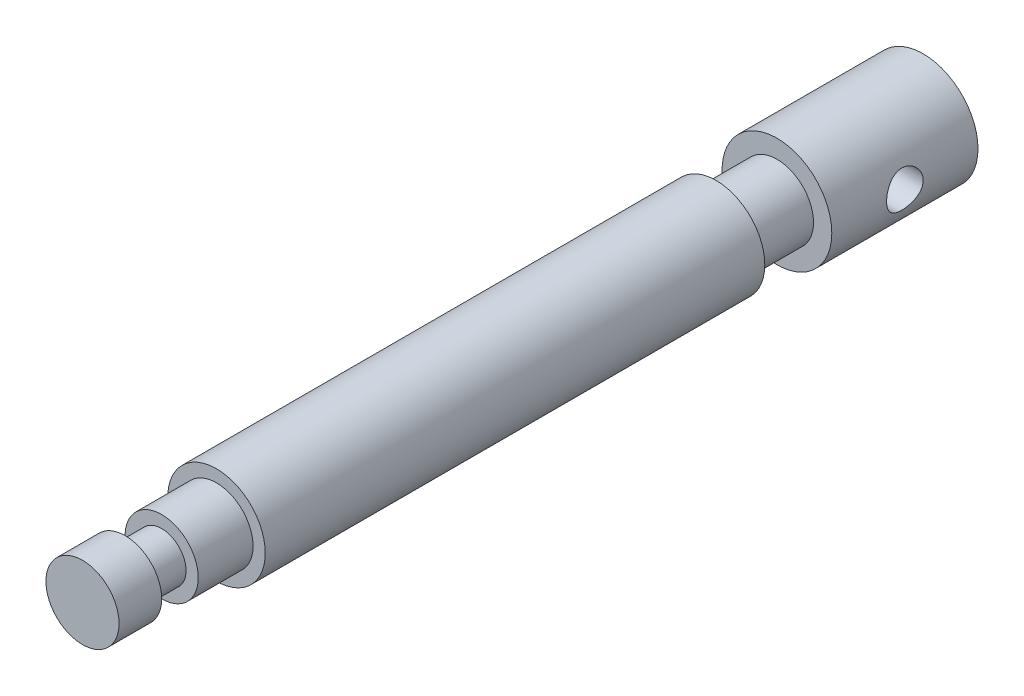
ISO-10303-21;
HEADER;
FILE_DESCRIPTION(('STEP AP214'),'2;1');
FILE_NAME('part.step','',(''),(''),'','','');
FILE_SCHEMA(('AUTOMOTIVE_DESIGN { 1 0 10303 214 1 1 1 1 }'));
ENDSEC;
DATA;
#1=APPLICATION_CONTEXT('core data for automotive mechanical design processes');
#2=APPLICATION_PROTOCOL_DEFINITION('international standard','automotive_design',2000,#1);
#3=PRODUCT_CONTEXT('',#1,'mechanical');
#4=PRODUCT('Part','Part','',(#3));
#5=PRODUCT_RELATED_PRODUCT_CATEGORY('part','',(#4));
#6=PRODUCT_DEFINITION_FORMATION('','',#4);
#7=PRODUCT_DEFINITION_CONTEXT('part definition',#1,'design');
#8=PRODUCT_DEFINITION('design','',#6,#7);
#9=PRODUCT_DEFINITION_SHAPE('','',#8);
#10=(LENGTH_UNIT() NAMED_UNIT(*) SI_UNIT(.MILLI.,.METRE.));
#11=(NAMED_UNIT(*) PLANE_ANGLE_UNIT() SI_UNIT($,.RADIAN.));
#12=(NAMED_UNIT(*) SI_UNIT($,.STERADIAN.) SOLID_ANGLE_UNIT());
#13=UNCERTAINTY_MEASURE_WITH_UNIT(LENGTH_MEASURE(1.E-05),#10,'distance_accuracy_value','');
#14=(GEOMETRIC_REPRESENTATION_CONTEXT(3) GLOBAL_UNCERTAINTY_ASSIGNED_CONTEXT((#13)) GLOBAL_UNIT_ASSIGNED_CONTEXT((#10,
#11,#12)) REPRESENTATION_CONTEXT('',''));
#15=CARTESIAN_POINT('',(0.,0.,0.));
#16=DIRECTION('',(0.,0.,1.));
#17=DIRECTION('',(1.,0.,0.));
#18=AXIS2_PLACEMENT_3D('',#15,#16,#17);
#19=CARTESIAN_POINT('',(4.44089209850063E-13,7.99999999999956,-33.79917184265));
#20=DIRECTION('',(0.,0.,1.));
#21=DIRECTION('',(1.,0.,0.));
#22=AXIS2_PLACEMENT_3D('',#19,#20,#21);
#23=PLANE('',#22);
#24=CARTESIAN_POINT('',(2.22044604925031E-13,0.,-33.7991718426501));
#25=DIRECTION('',(0.,0.,1.));
#26=DIRECTION('',(1.,0.,0.));
#27=AXIS2_PLACEMENT_3D('',#24,#25,#26);
#28=CIRCLE('',#27,8.);
#29=CARTESIAN_POINT('',(8.00000000000024,0.,-33.7991718426501));
#30=VERTEX_POINT('',#29);
#31=EDGE_CURVE('E56',#30,#30,#28,.T.);
#32=ORIENTED_EDGE('',*,*,#31,.F.);
#33=EDGE_LOOP('',(#32));
#34=FACE_BOUND('',#33,.T.);
#35=CARTESIAN_POINT('',(2.22044604925031E-13,0.,-33.7991718426501));
#36=DIRECTION('',(0.,0.,1.));
#37=DIRECTION('',(1.,0.,0.));
#38=AXIS2_PLACEMENT_3D('',#35,#36,#37);
#39=CIRCLE('',#38,6.);
#40=CARTESIAN_POINT('',(6.00000000000024,0.,-33.7991718426501));
#41=VERTEX_POINT('',#40);
#42=EDGE_CURVE('E110',#41,#41,#39,.T.);
#43=ORIENTED_EDGE('',*,*,#42,.T.);
#44=EDGE_LOOP('',(#43));
#45=FACE_BOUND('',#44,.T.);
#46=ADVANCED_FACE('F41',(#34,#45),#23,.F.);
#47=CARTESIAN_POINT('',(-1.11022302462516E-13,0.,78.3498964803312));
#48=DIRECTION('',(0.,0.,1.));
#49=DIRECTION('',(1.,0.,0.));
#50=AXIS2_PLACEMENT_3D('',#47,#48,#49);
#51=CYLINDRICAL_SURFACE('',#50,8.);
#52=CARTESIAN_POINT('',(1.11022302462516E-13,0.,48.2008281573498));
#53=DIRECTION('',(0.,0.,1.));
#54=DIRECTION('',(1.,0.,0.));
#55=AXIS2_PLACEMENT_3D('',#52,#53,#54);
#56=CIRCLE('',#55,8.);
#57=CARTESIAN_POINT('',(8.00000000000013,0.,48.2008281573498));
#58=VERTEX_POINT('',#57);
#59=EDGE_CURVE('E64',#58,#58,#56,.T.);
#60=ORIENTED_EDGE('',*,*,#59,.F.);
#61=EDGE_LOOP('',(#60));
#62=FACE_BOUND('',#61,.T.);
#63=ORIENTED_EDGE('',*,*,#31,.T.);
#64=EDGE_LOOP('',(#63));
#65=FACE_BOUND('',#64,.T.);
#66=ADVANCED_FACE('F94',(#62,#65),#51,.T.);
#67=CARTESIAN_POINT('',(0.,7.99999999999912,48.2008281573498));
#68=DIRECTION('',(0.,0.,-1.));
#69=DIRECTION('',(-1.,0.,0.));
#70=AXIS2_PLACEMENT_3D('',#67,#68,#69);
#71=PLANE('',#70);
#72=CARTESIAN_POINT('',(1.11022302462516E-13,0.,48.2008281573498));
#73=DIRECTION('',(0.,0.,1.));
#74=DIRECTION('',(1.,0.,0.));
#75=AXIS2_PLACEMENT_3D('',#72,#73,#74);
#76=CIRCLE('',#75,6.);
#77=CARTESIAN_POINT('',(6.00000000000013,0.,48.2008281573498));
#78=VERTEX_POINT('',#77);
#79=EDGE_CURVE('E143',#78,#78,#76,.T.);
#80=ORIENTED_EDGE('',*,*,#79,.F.);
#81=EDGE_LOOP('',(#80));
#82=FACE_BOUND('',#81,.T.);
#83=ORIENTED_EDGE('',*,*,#59,.T.);
#84=EDGE_LOOP('',(#83));
#85=FACE_BOUND('',#84,.T.);
#86=ADVANCED_FACE('F102',(#82,#85),#71,.F.);
#87=CARTESIAN_POINT('',(-1.11022302462516E-13,0.,78.3498964803312));
#88=DIRECTION('',(0.,0.,1.));
#89=DIRECTION('',(1.,0.,0.));
#90=AXIS2_PLACEMENT_3D('',#87,#88,#89);
#91=CYLINDRICAL_SURFACE('',#90,6.);
#92=CARTESIAN_POINT('',(-1.11022302462516E-13,-4.44089209850063E-13,57.2008281573498));
#93=DIRECTION('',(0.,0.,1.));
#94=DIRECTION('',(1.,0.,0.));
#95=AXIS2_PLACEMENT_3D('',#92,#93,#94);
#96=CIRCLE('',#95,6.);
#97=CARTESIAN_POINT('',(5.9999999999999,-4.43423076035288E-13,57.2008281573498));
#98=VERTEX_POINT('',#97);
#99=EDGE_CURVE('E139',#98,#98,#96,.T.);
#100=ORIENTED_EDGE('',*,*,#99,.F.);
#101=EDGE_LOOP('',(#100));
#102=FACE_BOUND('',#101,.T.);
#103=ORIENTED_EDGE('',*,*,#79,.T.);
#104=EDGE_LOOP('',(#103));
#105=FACE_BOUND('',#104,.T.);
#106=ADVANCED_FACE('F152',(#102,#105),#91,.T.);
#107=CARTESIAN_POINT('',(-2.22044604925031E-13,6.00000000000023,57.2008281573509));
#108=DIRECTION('',(0.,0.,-1.));
#109=DIRECTION('',(-1.,0.,0.));
#110=AXIS2_PLACEMENT_3D('',#107,#108,#109);
#111=PLANE('',#110);
#112=CARTESIAN_POINT('',(-1.11022302462516E-13,-4.44089209850063E-13,57.2008281573498));
#113=DIRECTION('',(0.,0.,1.));
#114=DIRECTION('',(1.,0.,0.));
#115=AXIS2_PLACEMENT_3D('',#112,#113,#114);
#116=CIRCLE('',#115,4.);
#117=CARTESIAN_POINT('',(3.9999999999999,-4.43645120640213E-13,57.2008281573498));
#118=VERTEX_POINT('',#117);
#119=EDGE_CURVE('E136',#118,#118,#116,.T.);
#120=ORIENTED_EDGE('',*,*,#119,.F.);
#121=EDGE_LOOP('',(#120));
#122=FACE_BOUND('',#121,.T.);
#123=ORIENTED_EDGE('',*,*,#99,.T.);
#124=EDGE_LOOP('',(#123));
#125=FACE_BOUND('',#124,.T.);
#126=ADVANCED_FACE('F163',(#122,#125),#111,.F.);
#127=CARTESIAN_POINT('',(-1.11022302462516E-13,0.,78.3498964803312));
#128=DIRECTION('',(0.,0.,1.));
#129=DIRECTION('',(1.,0.,0.));
#130=AXIS2_PLACEMENT_3D('',#127,#128,#129);
#131=CYLINDRICAL_SURFACE('',#130,4.);
#132=CARTESIAN_POINT('',(0.,0.,63.2008281573498));
#133=DIRECTION('',(0.,0.,1.));
#134=DIRECTION('',(1.,0.,0.));
#135=AXIS2_PLACEMENT_3D('',#132,#133,#134);
#136=CIRCLE('',#135,4.);
#137=CARTESIAN_POINT('',(4.00000000000001,0.,63.2008281573498));
#138=VERTEX_POINT('',#137);
#139=EDGE_CURVE('E135',#138,#138,#136,.T.);
#140=ORIENTED_EDGE('',*,*,#139,.F.);
#141=EDGE_LOOP('',(#140));
#142=FACE_BOUND('',#141,.T.);
#143=ORIENTED_EDGE('',*,*,#119,.T.);
#144=EDGE_LOOP('',(#143));
#145=FACE_BOUND('',#144,.T.);
#146=ADVANCED_FACE('F166',(#142,#145),#131,.T.);
#147=CARTESIAN_POINT('',(0.,4.,63.2008281573511));
#148=DIRECTION('',(0.,0.,1.));
#149=DIRECTION('',(1.,0.,0.));
#150=AXIS2_PLACEMENT_3D('',#147,#148,#149);
#151=PLANE('',#150);
#152=CARTESIAN_POINT('',(0.,0.,63.2008281573498));
#153=DIRECTION('',(0.,0.,1.));
#154=DIRECTION('',(1.,0.,0.));
#155=AXIS2_PLACEMENT_3D('',#152,#153,#154);
#156=CIRCLE('',#155,6.);
#157=CARTESIAN_POINT('',(6.00000000000002,0.,63.2008281573498));
#158=VERTEX_POINT('',#157);
#159=EDGE_CURVE('E126',#158,#158,#156,.T.);
#160=ORIENTED_EDGE('',*,*,#159,.F.);
#161=EDGE_LOOP('',(#160));
#162=FACE_BOUND('',#161,.T.);
#163=ORIENTED_EDGE('',*,*,#139,.T.);
#164=EDGE_LOOP('',(#163));
#165=FACE_BOUND('',#164,.T.);
#166=ADVANCED_FACE('F175',(#162,#165),#151,.F.);
#167=CARTESIAN_POINT('',(-1.11022302462516E-13,0.,78.3498964803312));
#168=DIRECTION('',(0.,0.,1.));
#169=DIRECTION('',(1.,0.,0.));
#170=AXIS2_PLACEMENT_3D('',#167,#168,#169);
#171=CYLINDRICAL_SURFACE('',#170,6.);
#172=CARTESIAN_POINT('',(0.,0.,70.2008281573498));
#173=DIRECTION('',(0.,0.,1.));
#174=DIRECTION('',(1.,0.,0.));
#175=AXIS2_PLACEMENT_3D('',#172,#173,#174);
#176=CIRCLE('',#175,6.);
#177=CARTESIAN_POINT('',(6.00000000000001,0.,70.2008281573498));
#178=VERTEX_POINT('',#177);
#179=EDGE_CURVE('E125',#178,#178,#176,.T.);
#180=ORIENTED_EDGE('',*,*,#179,.F.);
#181=EDGE_LOOP('',(#180));
#182=FACE_BOUND('',#181,.T.);
#183=ORIENTED_EDGE('',*,*,#159,.T.);
#184=EDGE_LOOP('',(#183));
#185=FACE_BOUND('',#184,.T.);
#186=ADVANCED_FACE('F176',(#182,#185),#171,.T.);
#187=CARTESIAN_POINT('',(0.,6.00000000000001,70.200828157351));
#188=DIRECTION('',(0.,0.,-1.));
#189=DIRECTION('',(-1.,0.,0.));
#190=AXIS2_PLACEMENT_3D('',#187,#188,#189);
#191=PLANE('',#190);
#192=ORIENTED_EDGE('',*,*,#179,.T.);
#193=EDGE_LOOP('',(#192));
#194=FACE_BOUND('',#193,.T.);
#195=ADVANCED_FACE('F179',(#194),#191,.F.);
#196=CARTESIAN_POINT('',(0.,8.9999999999999,-67.7991718426502));
#197=DIRECTION('',(0.,0.,1.));
#198=DIRECTION('',(1.,0.,0.));
#199=AXIS2_PLACEMENT_3D('',#196,#197,#198);
#200=PLANE('',#199);
#201=CARTESIAN_POINT('',(0.,-2.22044604925031E-13,-67.7991718426502));
#202=DIRECTION('',(0.,0.,1.));
#203=DIRECTION('',(1.,0.,0.));
#204=AXIS2_PLACEMENT_3D('',#201,#202,#203);
#205=CIRCLE('',#204,9.);
#206=CARTESIAN_POINT('',(9.00000000000002,-2.21045404202869E-13,-67.7991718426502));
#207=VERTEX_POINT('',#206);
#208=EDGE_CURVE('E119',#207,#207,#205,.T.);
#209=ORIENTED_EDGE('',*,*,#208,.F.);
#210=EDGE_LOOP('',(#209));
#211=FACE_BOUND('',#210,.T.);
#212=ADVANCED_FACE('F91',(#211),#200,.F.);
#213=CARTESIAN_POINT('',(-1.11022302462516E-13,0.,78.3498964803312));
#214=DIRECTION('',(0.,0.,1.));
#215=DIRECTION('',(1.,0.,0.));
#216=AXIS2_PLACEMENT_3D('',#213,#214,#215);
#217=CYLINDRICAL_SURFACE('',#216,9.);
#218=CARTESIAN_POINT('',(-9.00000000000012,0.,-58.799171842649));
#219=CARTESIAN_POINT('',(-9.00000045902853,0.163690088660168,-58.799172603844));
#220=CARTESIAN_POINT('',(-8.9954930852267,0.327375583615664,-58.7857310442674));
#221=CARTESIAN_POINT('',(-8.97795630609828,0.6499252826189,-58.7324845161974));
#222=CARTESIAN_POINT('',(-8.96492601606378,0.808788984356388,-58.6926768108023));
#223=CARTESIAN_POINT('',(-8.93175923719251,1.1169983685053,-58.5882141124969));
#224=CARTESIAN_POINT('',(-8.91163463192553,1.26635947765815,-58.5236006552712));
#225=CARTESIAN_POINT('',(-8.86633337152053,1.55212481041604,-58.371548324134));
#226=CARTESIAN_POINT('',(-8.84115572003326,1.68852647087612,-58.2841049476412));
#227=CARTESIAN_POINT('',(-8.78742283329007,1.94922502506681,-58.0856944280728));
#228=CARTESIAN_POINT('',(-8.75878669391383,2.073011100895,-57.9740781398675));
#229=CARTESIAN_POINT('',(-8.70180944349356,2.30049807810623,-57.7318703785293));
#230=CARTESIAN_POINT('',(-8.67346839871565,2.40419455646821,-57.6012747378635));
#231=CARTESIAN_POINT('',(-8.61939997431734,2.5914748266834,-57.3202164970597));
#232=CARTESIAN_POINT('',(-8.59377117827051,2.67439457466308,-57.1692906234527));
#233=CARTESIAN_POINT('',(-8.54925916255838,2.81345662163321,-56.8546435592734));
#234=CARTESIAN_POINT('',(-8.53037388482246,2.86960709216023,-56.6909262911608));
#235=CARTESIAN_POINT('',(-8.50233909808137,2.95162038452741,-56.3611521781588));
#236=CARTESIAN_POINT('',(-8.49288287308859,2.97844034481532,-56.1953602171818));
#237=CARTESIAN_POINT('',(-8.48386969888519,3.00402337000344,-55.8613805801813));
#238=CARTESIAN_POINT('',(-8.48430969068137,3.00279510481408,-55.6931936605214));
#239=CARTESIAN_POINT('',(-8.49477045024496,2.97305971111018,-55.367361951317));
#240=CARTESIAN_POINT('',(-8.50435247602606,2.94580173950099,-55.209586633892));
#241=CARTESIAN_POINT('',(-8.53129973173667,2.86681848854825,-54.9009915838286));
#242=CARTESIAN_POINT('',(-8.54866589352293,2.81509027977553,-54.7501726863438));
#243=CARTESIAN_POINT('',(-8.58953733393723,2.68781717418056,-54.4569335938746));
#244=CARTESIAN_POINT('',(-8.61313697379381,2.61190214612182,-54.3146877662405));
#245=CARTESIAN_POINT('',(-8.6637767572717,2.43866731890945,-54.0445591178099));
#246=CARTESIAN_POINT('',(-8.69081789371292,2.34134133709196,-53.9166804618488));
#247=CARTESIAN_POINT('',(-8.74701987503116,2.12204799804664,-53.6718970481666));
#248=CARTESIAN_POINT('',(-8.77621768064513,1.99905945022896,-53.5559137591219));
#249=CARTESIAN_POINT('',(-8.83220815161146,1.73501870991027,-53.3459780426589));
#250=CARTESIAN_POINT('',(-8.85900058614198,1.59396478698247,-53.2520277281556));
#251=CARTESIAN_POINT('',(-8.9075132381337,1.29584283913879,-53.0880829419438));
#252=CARTESIAN_POINT('',(-8.92918050024142,1.13862982924901,-53.0183353686268));
#253=CARTESIAN_POINT('',(-8.96461701433304,0.813807250093453,-52.9065623207819));
#254=CARTESIAN_POINT('',(-8.97838900964578,0.646201314464719,-52.8645272163787));
#255=CARTESIAN_POINT('',(-8.99602881214266,0.313151488587711,-52.8110048445819));
#256=CARTESIAN_POINT('',(-9.00030005501188,0.14792879959435,-52.7982724151308));
#257=CARTESIAN_POINT('',(-8.999667080845,-0.182325209880841,-52.8001698634445));
#258=CARTESIAN_POINT('',(-8.99476441258062,-0.347356557959032,-52.8147951225886));
#259=CARTESIAN_POINT('',(-8.97660074151284,-0.667559598913051,-52.8700075658568));
#260=CARTESIAN_POINT('',(-8.96358596133584,-0.822878420505058,-52.9098304607975));
#261=CARTESIAN_POINT('',(-8.93075540490211,-1.1245678757394,-53.0133521760497));
#262=CARTESIAN_POINT('',(-8.91093876139983,-1.2709373655264,-53.0770540410534));
#263=CARTESIAN_POINT('',(-8.86586793861824,-1.55486488918059,-53.2283831381726));
#264=CARTESIAN_POINT('',(-8.84048444267355,-1.69208987765252,-53.3165956224993));
#265=CARTESIAN_POINT('',(-8.78715761748771,-1.95019449040766,-53.5137542926902));
#266=CARTESIAN_POINT('',(-8.75921350781411,-2.07106910338712,-53.6227068107454));
#267=CARTESIAN_POINT('',(-8.7023054394126,-2.29875752341915,-53.8641080956701));
#268=CARTESIAN_POINT('',(-8.67335283262268,-2.40468290773796,-53.9973995234307));
#269=CARTESIAN_POINT('',(-8.61899919884124,-2.59277256697143,-54.2804865460827));
#270=CARTESIAN_POINT('',(-8.5935982014596,-2.67493664379341,-54.4302822785524));
#271=CARTESIAN_POINT('',(-8.54947175374095,-2.8127907912492,-54.74219088852));
#272=CARTESIAN_POINT('',(-8.53073282378917,-2.86853439649528,-54.9042780801566));
#273=CARTESIAN_POINT('',(-8.50232496919368,-2.95168400027845,-55.2363077927826));
#274=CARTESIAN_POINT('',(-8.4926519587094,-2.97910276486227,-55.4062467388633));
#275=CARTESIAN_POINT('',(-8.48393576622554,-3.00382884743224,-55.7397631307729));
#276=CARTESIAN_POINT('',(-8.48437200772266,-3.00261077192513,-55.9032188635106));
#277=CARTESIAN_POINT('',(-8.49453809471611,-2.97372688034595,-56.2274670674164));
#278=CARTESIAN_POINT('',(-8.50426738708083,-2.94606263837585,-56.3882596965155));
#279=CARTESIAN_POINT('',(-8.53153572914683,-2.86611543938797,-56.6995788316575));
#280=CARTESIAN_POINT('',(-8.5489229406746,-2.81431003804611,-56.8502423176634));
#281=CARTESIAN_POINT('',(-8.58949196455426,-2.68793809727886,-57.1408540634648));
#282=CARTESIAN_POINT('',(-8.61267506290174,-2.61336650566144,-57.2807999362143));
#283=CARTESIAN_POINT('',(-8.66348487678137,-2.43978207775027,-57.5526228524189));
#284=CARTESIAN_POINT('',(-8.69126134926442,-2.33984472829322,-57.6838813483448));
#285=CARTESIAN_POINT('',(-8.74750068849779,-2.11992864940635,-57.9282412828023));
#286=CARTESIAN_POINT('',(-8.77596374737095,-1.99994425335427,-58.0413375697144));
#287=CARTESIAN_POINT('',(-8.83170091576596,-1.73772467076208,-58.2506050795176));
#288=CARTESIAN_POINT('',(-8.85888545403764,-1.59480454049895,-58.3459448859024));
#289=CARTESIAN_POINT('',(-8.90777973517872,-1.29407207221961,-58.5111431292009));
#290=CARTESIAN_POINT('',(-8.92949087723837,-1.136263554397,-58.5810080804152));
#291=CARTESIAN_POINT('',(-8.96416545205664,-0.81748094160303,-58.6903367401151));
#292=CARTESIAN_POINT('',(-8.97747637267588,-0.656963273029262,-58.7310192414392));
#293=CARTESIAN_POINT('',(-8.99539221192668,-0.330961248030728,-58.7854326846804));
#294=CARTESIAN_POINT('',(-8.99999953595718,-0.165478276706242,-58.7991710731387));
#295=CARTESIAN_POINT('',(-9.00000000000012,0.,-58.799171842649));
#296=B_SPLINE_CURVE_WITH_KNOTS('',3,(#218,#219,#220,#221,#222,#223,#224,#225,#226,#227,#228,
#229,#230,#231,#232,#233,#234,#235,#236,#237,#238,#239,#240,#241,#242,#243,#244,#245,#246,#247,
#248,#249,#250,#251,#252,#253,#254,#255,#256,#257,#258,#259,#260,#261,#262,#263,#264,#265,#266,
#267,#268,#269,#270,#271,#272,#273,#274,#275,#276,#277,#278,#279,#280,#281,#282,#283,#284,#285,
#286,#287,#288,#289,#290,#291,#292,#293,#294,#295),.UNSPECIFIED.,.T.,.F.,(4,2,2,2,2,2,2,2,2,2,2,
2,2,2,2,2,2,2,2,2,2,2,2,2,2,2,2,2,2,2,2,2,2,2,2,2,2,2,4),(0.,0.490461318078023,0.9809735558026,
1.47066801861085,1.96045913339728,2.46554052848267,2.97073299862592,3.4904515447041,
4.01001134078498,4.51205777225521,5.01394901962455,5.49290479653835,5.9719179256644,
6.45864513465382,6.94551307674607,7.45779917434091,7.97013437899849,8.48755216951072,
9.00479006631636,9.49960749525519,9.99434139492532,10.474744739347,10.9552093585243,
11.4483119953132,11.9415654246577,12.4572306864235,12.9729002470509,13.4875204148041,
14.0019085411761,14.4898699819286,14.9778023805421,15.4564676124133,15.9352391452801,
16.4349020007549,16.934706333714,17.4539898250533,17.9731404345737,18.4690967512144,
18.9649159811442),.UNSPECIFIED.);
#297=CARTESIAN_POINT('',(-9.00000000000012,0.,-58.799171842649));
#298=VERTEX_POINT('',#297);
#299=EDGE_CURVE('E10',#298,#298,#296,.T.);
#300=ORIENTED_EDGE('',*,*,#299,.T.);
#301=EDGE_LOOP('',(#300));
#302=FACE_BOUND('',#301,.T.);
#303=CARTESIAN_POINT('',(9.00000000000001,0.,-58.7991718426502));
#304=CARTESIAN_POINT('',(9.00000045902836,-0.163690088659977,-58.799172603845));
#305=CARTESIAN_POINT('',(8.99549308522625,-0.327375583615219,-58.7857310442671));
#306=CARTESIAN_POINT('',(8.97795630609833,-0.64992528261868,-58.7324845161978));
#307=CARTESIAN_POINT('',(8.96492601606464,-0.80878898435665,-58.6926768108045));
#308=CARTESIAN_POINT('',(8.93175923719342,-1.11699836850518,-58.5882141124992));
#309=CARTESIAN_POINT('',(8.91163463192567,-1.26635947765718,-58.5236006552717));
#310=CARTESIAN_POINT('',(8.8663333715202,-1.55212481041543,-58.3715483241344));
#311=CARTESIAN_POINT('',(8.84115572003323,-1.68852647087675,-58.2841049476434));
#312=CARTESIAN_POINT('',(8.7874228332901,-1.94922502506751,-58.0856944280753));
#313=CARTESIAN_POINT('',(8.75878669391361,-2.07301110089448,-57.9740781398686));
#314=CARTESIAN_POINT('',(8.70180944349366,-2.3004980781055,-57.7318703785296));
#315=CARTESIAN_POINT('',(8.67346839871632,-2.4041945564685,-57.6012747378645));
#316=CARTESIAN_POINT('',(8.61939997431801,-2.59147482668396,-57.320216497061));
#317=CARTESIAN_POINT('',(8.59377117827057,-2.67439457466287,-57.1692906234536));
#318=CARTESIAN_POINT('',(8.54925916255812,-2.81345662163266,-56.8546435592741));
#319=CARTESIAN_POINT('',(8.53037388482248,-2.86960709216012,-56.6909262911618));
#320=CARTESIAN_POINT('',(8.50233909808135,-2.95162038452752,-56.36115217816));
#321=CARTESIAN_POINT('',(8.49288287308826,-2.97844034481522,-56.1953602171829));
#322=CARTESIAN_POINT('',(8.48386969888514,-3.00402337000336,-55.8613805801825));
#323=CARTESIAN_POINT('',(8.48430969068193,-3.00279510481421,-55.6931936605226));
#324=CARTESIAN_POINT('',(8.49477045024529,-2.97305971111048,-55.367361951318));
#325=CARTESIAN_POINT('',(8.50435247602565,-2.94580173950125,-55.209586633893));
#326=CARTESIAN_POINT('',(8.53129973173646,-2.86681848854852,-54.9009915838296));
#327=CARTESIAN_POINT('',(8.54866589352367,-2.81509027977585,-54.750172686345));
#328=CARTESIAN_POINT('',(8.5895373339378,-2.68781717418119,-54.4569335938758));
#329=CARTESIAN_POINT('',(8.61313697379323,-2.61190214612272,-54.3146877662415));
#330=CARTESIAN_POINT('',(8.66377675727137,-2.43866731891017,-54.0445591178115));
#331=CARTESIAN_POINT('',(8.69081789371397,-2.34134133709221,-53.9166804618513));
#332=CARTESIAN_POINT('',(8.74701987503237,-2.12204799804714,-53.6718970481688));
#333=CARTESIAN_POINT('',(8.77621768064496,-1.99905945023021,-53.5559137591227));
#334=CARTESIAN_POINT('',(8.83220815161068,-1.73501870991135,-53.3459780426599));
#335=CARTESIAN_POINT('',(8.85900058614198,-1.59396478698263,-53.252027728158));
#336=CARTESIAN_POINT('',(8.90751323813393,-1.29584283913864,-53.088082941946));
#337=CARTESIAN_POINT('',(8.92918050024107,-1.13862982924947,-53.0183353686273));
#338=CARTESIAN_POINT('',(8.96461701433281,-0.813807250094185,-52.9065623207819));
#339=CARTESIAN_POINT('',(8.97838900964623,-0.646201314465094,-52.8645272163799));
#340=CARTESIAN_POINT('',(8.9960288121431,-0.313151488587794,-52.8110048445831));
#341=CARTESIAN_POINT('',(9.00030005501168,-0.147928799594482,-52.7982724151308));
#342=CARTESIAN_POINT('',(8.99966708084476,0.182325209880679,-52.8001698634444));
#343=CARTESIAN_POINT('',(8.99476441258096,0.34735655795889,-52.8147951225898));
#344=CARTESIAN_POINT('',(8.97660074151318,0.667559598912934,-52.8700075658581));
#345=CARTESIAN_POINT('',(8.96358596133564,0.822878420504946,-52.9098304607977));
#346=CARTESIAN_POINT('',(8.93075540490194,1.12456787573898,-53.0133521760493));
#347=CARTESIAN_POINT('',(8.91093876140025,1.27093736552567,-53.0770540410535));
#348=CARTESIAN_POINT('',(8.86586793861867,1.55486488917977,-53.2283831381727));
#349=CARTESIAN_POINT('',(8.84048444267338,1.69208987765192,-53.316595622499));
#350=CARTESIAN_POINT('',(8.78715761748766,1.9501944904072,-53.5137542926898));
#351=CARTESIAN_POINT('',(8.75921350781479,2.0710691033866,-53.6227068107454));
#352=CARTESIAN_POINT('',(8.70230543941327,2.29875752341875,-53.8641080956701));
#353=CARTESIAN_POINT('',(8.67335283262254,2.40468290773777,-53.9973995234304));
#354=CARTESIAN_POINT('',(8.61899919884108,2.59277256697118,-54.2804865460823));
#355=CARTESIAN_POINT('',(8.59359820146023,2.67493664379289,-54.4302822785523));
#356=CARTESIAN_POINT('',(8.54947175374166,2.81279079124885,-54.7421908885199));
#357=CARTESIAN_POINT('',(8.53073282378916,2.86853439649535,-54.9042780801563));
#358=CARTESIAN_POINT('',(8.5023249691933,2.95168400027825,-55.2363077927823));
#359=CARTESIAN_POINT('',(8.49265195870937,2.97910276486137,-55.4062467388632));
#360=CARTESIAN_POINT('',(8.48393576622558,3.00382884743136,-55.739763130773));
#361=CARTESIAN_POINT('',(8.48437200772245,3.0026107719249,-55.9032188635107));
#362=CARTESIAN_POINT('',(8.49453809471587,2.97372688034618,-56.2274670674164));
#363=CARTESIAN_POINT('',(8.50426738708081,2.9460626383759,-56.3882596965155));
#364=CARTESIAN_POINT('',(8.53153572914685,2.86611543938791,-56.6995788316576));
#365=CARTESIAN_POINT('',(8.54892294067445,2.81431003804612,-56.8502423176635));
#366=CARTESIAN_POINT('',(8.58949196455399,2.6879380972788,-57.1408540634649));
#367=CARTESIAN_POINT('',(8.61267506290151,2.61336650566125,-57.2807999362143));
#368=CARTESIAN_POINT('',(8.66348487678114,2.43978207775004,-57.5526228524188));
#369=CARTESIAN_POINT('',(8.69126134926414,2.33984472829311,-57.6838813483448));
#370=CARTESIAN_POINT('',(8.74750068849764,2.11992864940636,-57.9282412828024));
#371=CARTESIAN_POINT('',(8.77596374737097,1.9999442533543,-58.0413375697145));
#372=CARTESIAN_POINT('',(8.83170091576597,1.73772467076192,-58.2506050795176));
#373=CARTESIAN_POINT('',(8.85888545403746,1.59480454049857,-58.3459448859024));
#374=CARTESIAN_POINT('',(8.9077797351786,1.29407207221914,-58.5111431292014));
#375=CARTESIAN_POINT('',(8.92949087723849,1.13626355439666,-58.5810080804164));
#376=CARTESIAN_POINT('',(8.96416545205672,0.817480941602713,-58.690336740116));
#377=CARTESIAN_POINT('',(8.97747637267571,0.656963273028864,-58.7310192414392));
#378=CARTESIAN_POINT('',(8.99539221192644,0.330961248030386,-58.7854326846805));
#379=CARTESIAN_POINT('',(8.99999953595713,0.165478276706038,-58.7991710731399));
#380=CARTESIAN_POINT('',(9.00000000000001,0.,-58.7991718426502));
#381=B_SPLINE_CURVE_WITH_KNOTS('',3,(#303,#304,#305,#306,#307,#308,#309,#310,#311,#312,#313,
#314,#315,#316,#317,#318,#319,#320,#321,#322,#323,#324,#325,#326,#327,#328,#329,#330,#331,#332,
#333,#334,#335,#336,#337,#338,#339,#340,#341,#342,#343,#344,#345,#346,#347,#348,#349,#350,#351,
#352,#353,#354,#355,#356,#357,#358,#359,#360,#361,#362,#363,#364,#365,#366,#367,#368,#369,#370,
#371,#372,#373,#374,#375,#376,#377,#378,#379,#380),.UNSPECIFIED.,.T.,.F.,(4,2,2,2,2,2,2,2,2,2,2,
2,2,2,2,2,2,2,2,2,2,2,2,2,2,2,2,2,2,2,2,2,2,2,2,2,2,2,4),(0.,0.490461318077797,
0.980973555802043,1.47066801861044,1.96045913339705,2.46554052848261,2.97073299862605,
3.49045154470416,4.01001134078492,4.51205777225511,5.01394901962448,5.49290479653831,
5.97191792566433,6.45864513465329,6.94551307674509,7.45779917434017,7.97013437899803,
8.48755216951055,9.00479006631634,9.4996074952553,9.99434139492569,10.4747447393468,
10.9552093585235,11.4483119953125,11.9415654246573,12.4572306864231,12.9729002470505,
13.4875204148037,14.0019085411758,14.4898699819284,14.9778023805419,15.4564676124131,
15.9352391452799,16.4349020007547,16.9347063337138,17.4539898250535,17.9731404345743,
18.4690967512147,18.9649159811442),.UNSPECIFIED.);
#382=CARTESIAN_POINT('',(9.00000000000001,0.,-58.7991718426502));
#383=VERTEX_POINT('',#382);
#384=EDGE_CURVE('E52',#383,#383,#381,.T.);
#385=ORIENTED_EDGE('',*,*,#384,.T.);
#386=EDGE_LOOP('',(#385));
#387=FACE_BOUND('',#386,.T.);
#388=CARTESIAN_POINT('',(1.11022302462516E-13,0.,-43.7991718426501));
#389=DIRECTION('',(0.,0.,1.));
#390=DIRECTION('',(1.,0.,0.));
#391=AXIS2_PLACEMENT_3D('',#388,#389,#390);
#392=CIRCLE('',#391,9.);
#393=CARTESIAN_POINT('',(9.00000000000013,0.,-43.7991718426501));
#394=VERTEX_POINT('',#393);
#395=EDGE_CURVE('E114',#394,#394,#392,.T.);
#396=ORIENTED_EDGE('',*,*,#395,.F.);
#397=EDGE_LOOP('',(#396));
#398=FACE_BOUND('',#397,.T.);
#399=ORIENTED_EDGE('',*,*,#208,.T.);
#400=EDGE_LOOP('',(#399));
#401=FACE_BOUND('',#400,.T.);
#402=ADVANCED_FACE('F73',(#302,#387,#398,#401),#217,.T.);
#403=CARTESIAN_POINT('',(1.11022302462516E-13,5.99999999999978,-43.799171842649));
#404=DIRECTION('',(0.,0.,-1.));
#405=DIRECTION('',(-1.,0.,0.));
#406=AXIS2_PLACEMENT_3D('',#403,#404,#405);
#407=PLANE('',#406);
#408=CARTESIAN_POINT('',(1.11022302462516E-13,0.,-43.7991718426501));
#409=DIRECTION('',(0.,0.,1.));
#410=DIRECTION('',(1.,0.,0.));
#411=AXIS2_PLACEMENT_3D('',#408,#409,#410);
#412=CIRCLE('',#411,6.);
#413=CARTESIAN_POINT('',(6.00000000000013,0.,-43.7991718426501));
#414=VERTEX_POINT('',#413);
#415=EDGE_CURVE('E107',#414,#414,#412,.T.);
#416=ORIENTED_EDGE('',*,*,#415,.F.);
#417=EDGE_LOOP('',(#416));
#418=FACE_BOUND('',#417,.T.);
#419=ORIENTED_EDGE('',*,*,#395,.T.);
#420=EDGE_LOOP('',(#419));
#421=FACE_BOUND('',#420,.T.);
#422=ADVANCED_FACE('F81',(#418,#421),#407,.F.);
#423=CARTESIAN_POINT('',(-1.11022302462516E-13,0.,78.3498964803312));
#424=DIRECTION('',(0.,0.,1.));
#425=DIRECTION('',(1.,0.,0.));
#426=AXIS2_PLACEMENT_3D('',#423,#424,#425);
#427=CYLINDRICAL_SURFACE('',#426,6.);
#428=ORIENTED_EDGE('',*,*,#42,.F.);
#429=EDGE_LOOP('',(#428));
#430=FACE_BOUND('',#429,.T.);
#431=ORIENTED_EDGE('',*,*,#415,.T.);
#432=EDGE_LOOP('',(#431));
#433=FACE_BOUND('',#432,.T.);
#434=ADVANCED_FACE('F80',(#430,#433),#427,.T.);
#435=CARTESIAN_POINT('',(-9.00000000000001,0.,-55.799171842649));
#436=DIRECTION('',(1.,0.,0.));
#437=DIRECTION('',(0.,0.,-1.));
#438=AXIS2_PLACEMENT_3D('',#435,#436,#437);
#439=CYLINDRICAL_SURFACE('',#438,3.);
#440=ORIENTED_EDGE('',*,*,#384,.F.);
#441=EDGE_LOOP('',(#440));
#442=FACE_BOUND('',#441,.T.);
#443=ORIENTED_EDGE('',*,*,#299,.F.);
#444=EDGE_LOOP('',(#443));
#445=FACE_BOUND('',#444,.T.);
#446=ADVANCED_FACE('F74',(#442,#445),#439,.F.);
#447=CLOSED_SHELL('',(#46,#66,#86,#106,#126,#146,#166,#186,#195,#212,#402,#422,#434,#446));
#448=MANIFOLD_SOLID_BREP('B2',#447);
#449=ADVANCED_BREP_SHAPE_REPRESENTATION('',(#18,#448),#14);
#450=SHAPE_DEFINITION_REPRESENTATION(#9,#449);
ENDSEC;
END-ISO-10303-21;
